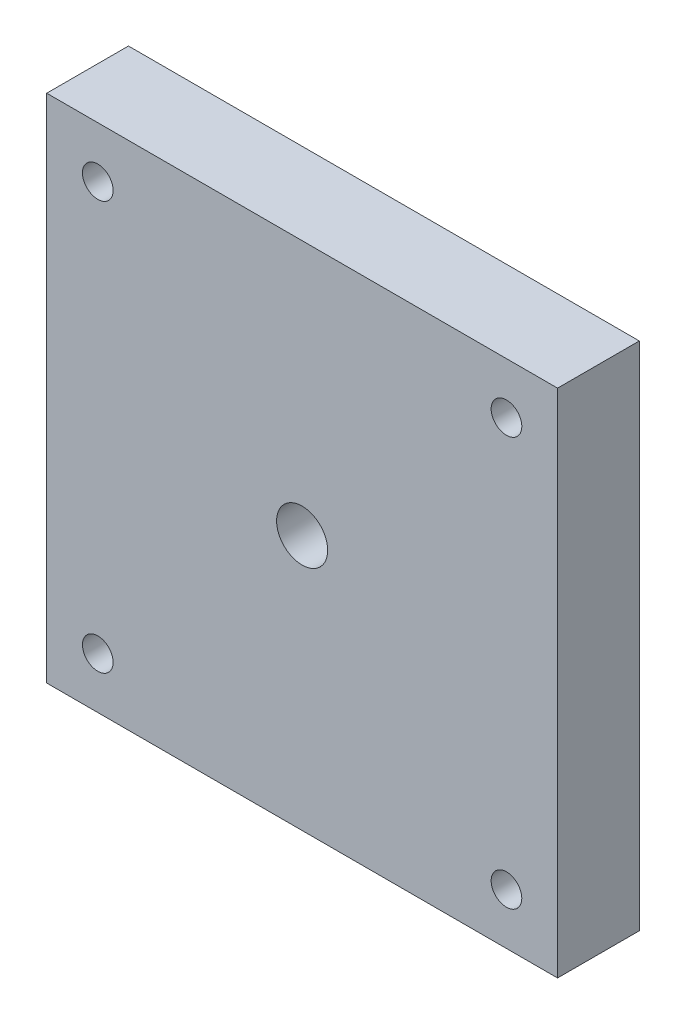
ISO-10303-21;
HEADER;
FILE_DESCRIPTION(('STEP AP214'),'2;1');
FILE_NAME('part.step','',(''),(''),'','','');
FILE_SCHEMA(('AUTOMOTIVE_DESIGN { 1 0 10303 214 1 1 1 1 }'));
ENDSEC;
DATA;
#1=APPLICATION_CONTEXT('core data for automotive mechanical design processes');
#2=APPLICATION_PROTOCOL_DEFINITION('international standard','automotive_design',2000,#1);
#3=PRODUCT_CONTEXT('',#1,'mechanical');
#4=PRODUCT('Part','Part','',(#3));
#5=PRODUCT_RELATED_PRODUCT_CATEGORY('part','',(#4));
#6=PRODUCT_DEFINITION_FORMATION('','',#4);
#7=PRODUCT_DEFINITION_CONTEXT('part definition',#1,'design');
#8=PRODUCT_DEFINITION('design','',#6,#7);
#9=PRODUCT_DEFINITION_SHAPE('','',#8);
#10=(LENGTH_UNIT() NAMED_UNIT(*) SI_UNIT(.MILLI.,.METRE.));
#11=(NAMED_UNIT(*) PLANE_ANGLE_UNIT() SI_UNIT($,.RADIAN.));
#12=(NAMED_UNIT(*) SI_UNIT($,.STERADIAN.) SOLID_ANGLE_UNIT());
#13=UNCERTAINTY_MEASURE_WITH_UNIT(LENGTH_MEASURE(1.E-05),#10,'distance_accuracy_value','');
#14=(GEOMETRIC_REPRESENTATION_CONTEXT(3) GLOBAL_UNCERTAINTY_ASSIGNED_CONTEXT((#13)) GLOBAL_UNIT_ASSIGNED_CONTEXT((#10,
#11,#12)) REPRESENTATION_CONTEXT('',''));
#15=CARTESIAN_POINT('',(0.,0.,0.));
#16=DIRECTION('',(0.,0.,1.));
#17=DIRECTION('',(1.,0.,0.));
#18=AXIS2_PLACEMENT_3D('',#15,#16,#17);
#19=CARTESIAN_POINT('',(0.,0.,8.));
#20=DIRECTION('',(0.,0.,1.));
#21=DIRECTION('',(1.,0.,0.));
#22=AXIS2_PLACEMENT_3D('',#19,#20,#21);
#23=PLANE('',#22);
#24=CARTESIAN_POINT('',(20.,-20.,8.));
#25=DIRECTION('',(0.,0.,1.));
#26=DIRECTION('',(1.,0.,0.));
#27=AXIS2_PLACEMENT_3D('',#24,#25,#26);
#28=CIRCLE('',#27,1.5);
#29=CARTESIAN_POINT('',(21.5,-20.,8.));
#30=VERTEX_POINT('',#29);
#31=EDGE_CURVE('E128',#30,#30,#28,.T.);
#32=ORIENTED_EDGE('',*,*,#31,.F.);
#33=EDGE_LOOP('',(#32));
#34=FACE_BOUND('',#33,.T.);
#35=CARTESIAN_POINT('',(-20.,20.,8.));
#36=DIRECTION('',(0.,0.,1.));
#37=DIRECTION('',(1.,0.,0.));
#38=AXIS2_PLACEMENT_3D('',#35,#36,#37);
#39=CIRCLE('',#38,1.5);
#40=CARTESIAN_POINT('',(-18.5,20.,8.));
#41=VERTEX_POINT('',#40);
#42=EDGE_CURVE('E116',#41,#41,#39,.T.);
#43=ORIENTED_EDGE('',*,*,#42,.F.);
#44=EDGE_LOOP('',(#43));
#45=FACE_BOUND('',#44,.T.);
#46=DIRECTION('',(0.,-1.,0.));
#47=VECTOR('',#46,1.);
#48=CARTESIAN_POINT('',(-25.,25.,8.));
#49=LINE('',#48,#47);
#50=CARTESIAN_POINT('',(-25.,25.,8.));
#51=VERTEX_POINT('',#50);
#52=CARTESIAN_POINT('',(-25.,-25.,8.));
#53=VERTEX_POINT('',#52);
#54=EDGE_CURVE('E86',#51,#53,#49,.T.);
#55=ORIENTED_EDGE('',*,*,#54,.T.);
#56=DIRECTION('',(1.,0.,0.));
#57=VECTOR('',#56,1.);
#58=CARTESIAN_POINT('',(-25.,-25.,8.));
#59=LINE('',#58,#57);
#60=CARTESIAN_POINT('',(25.,-25.,8.));
#61=VERTEX_POINT('',#60);
#62=EDGE_CURVE('E81',#53,#61,#59,.T.);
#63=ORIENTED_EDGE('',*,*,#62,.T.);
#64=DIRECTION('',(0.,1.,0.));
#65=VECTOR('',#64,1.);
#66=CARTESIAN_POINT('',(25.,25.,8.));
#67=LINE('',#66,#65);
#68=CARTESIAN_POINT('',(25.,25.,8.));
#69=VERTEX_POINT('',#68);
#70=EDGE_CURVE('E84',#61,#69,#67,.T.);
#71=ORIENTED_EDGE('',*,*,#70,.T.);
#72=DIRECTION('',(-1.,0.,0.));
#73=VECTOR('',#72,1.);
#74=CARTESIAN_POINT('',(-25.,25.,8.));
#75=LINE('',#74,#73);
#76=EDGE_CURVE('E51',#69,#51,#75,.T.);
#77=ORIENTED_EDGE('',*,*,#76,.T.);
#78=EDGE_LOOP('',(#55,#63,#71,#77));
#79=FACE_BOUND('',#78,.T.);
#80=CARTESIAN_POINT('',(0.,0.,8.));
#81=DIRECTION('',(0.,0.,1.));
#82=DIRECTION('',(1.,0.,0.));
#83=AXIS2_PLACEMENT_3D('',#80,#81,#82);
#84=CIRCLE('',#83,2.5);
#85=CARTESIAN_POINT('',(2.5,0.,8.));
#86=VERTEX_POINT('',#85);
#87=EDGE_CURVE('E101',#86,#86,#84,.T.);
#88=ORIENTED_EDGE('',*,*,#87,.F.);
#89=EDGE_LOOP('',(#88));
#90=FACE_BOUND('',#89,.T.);
#91=CARTESIAN_POINT('',(20.,20.,8.));
#92=DIRECTION('',(0.,0.,1.));
#93=DIRECTION('',(-1.,0.,0.));
#94=AXIS2_PLACEMENT_3D('',#91,#92,#93);
#95=CIRCLE('',#94,1.5);
#96=CARTESIAN_POINT('',(18.5,20.,8.));
#97=VERTEX_POINT('',#96);
#98=EDGE_CURVE('E122',#97,#97,#95,.T.);
#99=ORIENTED_EDGE('',*,*,#98,.F.);
#100=EDGE_LOOP('',(#99));
#101=FACE_BOUND('',#100,.T.);
#102=CARTESIAN_POINT('',(-20.,-20.,8.));
#103=DIRECTION('',(0.,0.,1.));
#104=DIRECTION('',(-1.,0.,0.));
#105=AXIS2_PLACEMENT_3D('',#102,#103,#104);
#106=CIRCLE('',#105,1.5);
#107=CARTESIAN_POINT('',(-21.5,-20.,8.));
#108=VERTEX_POINT('',#107);
#109=EDGE_CURVE('E134',#108,#108,#106,.T.);
#110=ORIENTED_EDGE('',*,*,#109,.F.);
#111=EDGE_LOOP('',(#110));
#112=FACE_BOUND('',#111,.T.);
#113=ADVANCED_FACE('F34',(#34,#45,#79,#90,#101,#112),#23,.T.);
#114=CARTESIAN_POINT('',(0.,0.,0.));
#115=DIRECTION('',(0.,0.,1.));
#116=DIRECTION('',(1.,0.,0.));
#117=AXIS2_PLACEMENT_3D('',#114,#115,#116);
#118=PLANE('',#117);
#119=CARTESIAN_POINT('',(20.,-20.,0.));
#120=DIRECTION('',(0.,0.,1.));
#121=DIRECTION('',(1.,0.,0.));
#122=AXIS2_PLACEMENT_3D('',#119,#120,#121);
#123=CIRCLE('',#122,1.5);
#124=CARTESIAN_POINT('',(21.5,-20.,0.));
#125=VERTEX_POINT('',#124);
#126=EDGE_CURVE('E131',#125,#125,#123,.T.);
#127=ORIENTED_EDGE('',*,*,#126,.T.);
#128=EDGE_LOOP('',(#127));
#129=FACE_BOUND('',#128,.T.);
#130=CARTESIAN_POINT('',(-20.,20.,0.));
#131=DIRECTION('',(0.,0.,1.));
#132=DIRECTION('',(1.,0.,0.));
#133=AXIS2_PLACEMENT_3D('',#130,#131,#132);
#134=CIRCLE('',#133,1.5);
#135=CARTESIAN_POINT('',(-18.5,20.,0.));
#136=VERTEX_POINT('',#135);
#137=EDGE_CURVE('E119',#136,#136,#134,.T.);
#138=ORIENTED_EDGE('',*,*,#137,.T.);
#139=EDGE_LOOP('',(#138));
#140=FACE_BOUND('',#139,.T.);
#141=DIRECTION('',(0.,-1.,0.));
#142=VECTOR('',#141,1.);
#143=CARTESIAN_POINT('',(-25.,25.,0.));
#144=LINE('',#143,#142);
#145=CARTESIAN_POINT('',(-25.,25.,0.));
#146=VERTEX_POINT('',#145);
#147=CARTESIAN_POINT('',(-25.,-25.,0.));
#148=VERTEX_POINT('',#147);
#149=EDGE_CURVE('E98',#146,#148,#144,.T.);
#150=ORIENTED_EDGE('',*,*,#149,.F.);
#151=DIRECTION('',(-1.,0.,0.));
#152=VECTOR('',#151,1.);
#153=CARTESIAN_POINT('',(-25.,25.,0.));
#154=LINE('',#153,#152);
#155=CARTESIAN_POINT('',(25.,25.,0.));
#156=VERTEX_POINT('',#155);
#157=EDGE_CURVE('E74',#156,#146,#154,.T.);
#158=ORIENTED_EDGE('',*,*,#157,.F.);
#159=DIRECTION('',(0.,1.,0.));
#160=VECTOR('',#159,1.);
#161=CARTESIAN_POINT('',(25.,25.,0.));
#162=LINE('',#161,#160);
#163=CARTESIAN_POINT('',(25.,-25.,0.));
#164=VERTEX_POINT('',#163);
#165=EDGE_CURVE('E68',#164,#156,#162,.T.);
#166=ORIENTED_EDGE('',*,*,#165,.F.);
#167=DIRECTION('',(1.,0.,0.));
#168=VECTOR('',#167,1.);
#169=CARTESIAN_POINT('',(-25.,-25.,0.));
#170=LINE('',#169,#168);
#171=EDGE_CURVE('E90',#148,#164,#170,.T.);
#172=ORIENTED_EDGE('',*,*,#171,.F.);
#173=EDGE_LOOP('',(#150,#158,#166,#172));
#174=FACE_BOUND('',#173,.T.);
#175=CARTESIAN_POINT('',(0.,0.,0.));
#176=DIRECTION('',(0.,0.,1.));
#177=DIRECTION('',(1.,0.,0.));
#178=AXIS2_PLACEMENT_3D('',#175,#176,#177);
#179=CIRCLE('',#178,2.5);
#180=CARTESIAN_POINT('',(2.5,0.,0.));
#181=VERTEX_POINT('',#180);
#182=EDGE_CURVE('E113',#181,#181,#179,.T.);
#183=ORIENTED_EDGE('',*,*,#182,.T.);
#184=EDGE_LOOP('',(#183));
#185=FACE_BOUND('',#184,.T.);
#186=CARTESIAN_POINT('',(20.,20.,0.));
#187=DIRECTION('',(0.,0.,1.));
#188=DIRECTION('',(-1.,0.,0.));
#189=AXIS2_PLACEMENT_3D('',#186,#187,#188);
#190=CIRCLE('',#189,1.5);
#191=CARTESIAN_POINT('',(18.5,20.,0.));
#192=VERTEX_POINT('',#191);
#193=EDGE_CURVE('E125',#192,#192,#190,.T.);
#194=ORIENTED_EDGE('',*,*,#193,.T.);
#195=EDGE_LOOP('',(#194));
#196=FACE_BOUND('',#195,.T.);
#197=CARTESIAN_POINT('',(-20.,-20.,0.));
#198=DIRECTION('',(0.,0.,1.));
#199=DIRECTION('',(-1.,0.,0.));
#200=AXIS2_PLACEMENT_3D('',#197,#198,#199);
#201=CIRCLE('',#200,1.5);
#202=CARTESIAN_POINT('',(-21.5,-20.,0.));
#203=VERTEX_POINT('',#202);
#204=EDGE_CURVE('E137',#203,#203,#201,.T.);
#205=ORIENTED_EDGE('',*,*,#204,.T.);
#206=EDGE_LOOP('',(#205));
#207=FACE_BOUND('',#206,.T.);
#208=ADVANCED_FACE('F109',(#129,#140,#174,#185,#196,#207),#118,.F.);
#209=CARTESIAN_POINT('',(-25.,25.,8.));
#210=DIRECTION('',(1.,0.,0.));
#211=DIRECTION('',(0.,1.,0.));
#212=AXIS2_PLACEMENT_3D('',#209,#210,#211);
#213=PLANE('',#212);
#214=ORIENTED_EDGE('',*,*,#149,.T.);
#215=DIRECTION('',(0.,0.,-1.));
#216=VECTOR('',#215,1.);
#217=CARTESIAN_POINT('',(-25.,-25.,8.));
#218=LINE('',#217,#216);
#219=EDGE_CURVE('E11',#53,#148,#218,.T.);
#220=ORIENTED_EDGE('',*,*,#219,.F.);
#221=ORIENTED_EDGE('',*,*,#54,.F.);
#222=DIRECTION('',(0.,0.,-1.));
#223=VECTOR('',#222,1.);
#224=CARTESIAN_POINT('',(-25.,25.,8.));
#225=LINE('',#224,#223);
#226=EDGE_CURVE('E94',#51,#146,#225,.T.);
#227=ORIENTED_EDGE('',*,*,#226,.T.);
#228=EDGE_LOOP('',(#214,#220,#221,#227));
#229=FACE_BOUND('',#228,.T.);
#230=ADVANCED_FACE('F36',(#229),#213,.F.);
#231=CARTESIAN_POINT('',(-25.,-25.,8.));
#232=DIRECTION('',(0.,1.,0.));
#233=DIRECTION('',(0.,0.,1.));
#234=AXIS2_PLACEMENT_3D('',#231,#232,#233);
#235=PLANE('',#234);
#236=ORIENTED_EDGE('',*,*,#171,.T.);
#237=DIRECTION('',(0.,0.,-1.));
#238=VECTOR('',#237,1.);
#239=CARTESIAN_POINT('',(25.,-25.,8.));
#240=LINE('',#239,#238);
#241=EDGE_CURVE('E43',#61,#164,#240,.T.);
#242=ORIENTED_EDGE('',*,*,#241,.F.);
#243=ORIENTED_EDGE('',*,*,#62,.F.);
#244=ORIENTED_EDGE('',*,*,#219,.T.);
#245=EDGE_LOOP('',(#236,#242,#243,#244));
#246=FACE_BOUND('',#245,.T.);
#247=ADVANCED_FACE('F89',(#246),#235,.F.);
#248=CARTESIAN_POINT('',(25.,25.,8.));
#249=DIRECTION('',(-1.,0.,0.));
#250=DIRECTION('',(0.,-1.,0.));
#251=AXIS2_PLACEMENT_3D('',#248,#249,#250);
#252=PLANE('',#251);
#253=ORIENTED_EDGE('',*,*,#165,.T.);
#254=DIRECTION('',(0.,0.,-1.));
#255=VECTOR('',#254,1.);
#256=CARTESIAN_POINT('',(25.,25.,8.));
#257=LINE('',#256,#255);
#258=EDGE_CURVE('E91',#69,#156,#257,.T.);
#259=ORIENTED_EDGE('',*,*,#258,.F.);
#260=ORIENTED_EDGE('',*,*,#70,.F.);
#261=ORIENTED_EDGE('',*,*,#241,.T.);
#262=EDGE_LOOP('',(#253,#259,#260,#261));
#263=FACE_BOUND('',#262,.T.);
#264=ADVANCED_FACE('F92',(#263),#252,.F.);
#265=CARTESIAN_POINT('',(-25.,25.,8.));
#266=DIRECTION('',(0.,-1.,0.));
#267=DIRECTION('',(0.,0.,-1.));
#268=AXIS2_PLACEMENT_3D('',#265,#266,#267);
#269=PLANE('',#268);
#270=ORIENTED_EDGE('',*,*,#157,.T.);
#271=ORIENTED_EDGE('',*,*,#226,.F.);
#272=ORIENTED_EDGE('',*,*,#76,.F.);
#273=ORIENTED_EDGE('',*,*,#258,.T.);
#274=EDGE_LOOP('',(#270,#271,#272,#273));
#275=FACE_BOUND('',#274,.T.);
#276=ADVANCED_FACE('F106',(#275),#269,.F.);
#277=CARTESIAN_POINT('',(0.,0.,8.));
#278=DIRECTION('',(0.,0.,-1.));
#279=DIRECTION('',(-1.,0.,0.));
#280=AXIS2_PLACEMENT_3D('',#277,#278,#279);
#281=CYLINDRICAL_SURFACE('',#280,2.5);
#282=ORIENTED_EDGE('',*,*,#87,.T.);
#283=EDGE_LOOP('',(#282));
#284=FACE_BOUND('',#283,.T.);
#285=ORIENTED_EDGE('',*,*,#182,.F.);
#286=EDGE_LOOP('',(#285));
#287=FACE_BOUND('',#286,.T.);
#288=ADVANCED_FACE('F157',(#284,#287),#281,.F.);
#289=CARTESIAN_POINT('',(-20.,20.,8.));
#290=DIRECTION('',(0.,0.,-1.));
#291=DIRECTION('',(-1.,0.,0.));
#292=AXIS2_PLACEMENT_3D('',#289,#290,#291);
#293=CYLINDRICAL_SURFACE('',#292,1.5);
#294=ORIENTED_EDGE('',*,*,#42,.T.);
#295=EDGE_LOOP('',(#294));
#296=FACE_BOUND('',#295,.T.);
#297=ORIENTED_EDGE('',*,*,#137,.F.);
#298=EDGE_LOOP('',(#297));
#299=FACE_BOUND('',#298,.T.);
#300=ADVANCED_FACE('F203',(#296,#299),#293,.F.);
#301=CARTESIAN_POINT('',(20.,20.,8.));
#302=DIRECTION('',(0.,0.,-1.));
#303=DIRECTION('',(-1.,0.,0.));
#304=AXIS2_PLACEMENT_3D('',#301,#302,#303);
#305=CYLINDRICAL_SURFACE('',#304,1.5);
#306=ORIENTED_EDGE('',*,*,#98,.T.);
#307=EDGE_LOOP('',(#306));
#308=FACE_BOUND('',#307,.T.);
#309=ORIENTED_EDGE('',*,*,#193,.F.);
#310=EDGE_LOOP('',(#309));
#311=FACE_BOUND('',#310,.T.);
#312=ADVANCED_FACE('F211',(#308,#311),#305,.F.);
#313=CARTESIAN_POINT('',(20.,-20.,8.));
#314=DIRECTION('',(0.,0.,-1.));
#315=DIRECTION('',(-1.,0.,0.));
#316=AXIS2_PLACEMENT_3D('',#313,#314,#315);
#317=CYLINDRICAL_SURFACE('',#316,1.5);
#318=ORIENTED_EDGE('',*,*,#31,.T.);
#319=EDGE_LOOP('',(#318));
#320=FACE_BOUND('',#319,.T.);
#321=ORIENTED_EDGE('',*,*,#126,.F.);
#322=EDGE_LOOP('',(#321));
#323=FACE_BOUND('',#322,.T.);
#324=ADVANCED_FACE('F219',(#320,#323),#317,.F.);
#325=CARTESIAN_POINT('',(-20.,-20.,8.));
#326=DIRECTION('',(0.,0.,-1.));
#327=DIRECTION('',(-1.,0.,0.));
#328=AXIS2_PLACEMENT_3D('',#325,#326,#327);
#329=CYLINDRICAL_SURFACE('',#328,1.5);
#330=ORIENTED_EDGE('',*,*,#109,.T.);
#331=EDGE_LOOP('',(#330));
#332=FACE_BOUND('',#331,.T.);
#333=ORIENTED_EDGE('',*,*,#204,.F.);
#334=EDGE_LOOP('',(#333));
#335=FACE_BOUND('',#334,.T.);
#336=ADVANCED_FACE('F143',(#332,#335),#329,.F.);
#337=CLOSED_SHELL('',(#113,#208,#230,#247,#264,#276,#288,#300,#312,#324,#336));
#338=MANIFOLD_SOLID_BREP('B2',#337);
#339=ADVANCED_BREP_SHAPE_REPRESENTATION('',(#18,#338),#14);
#340=SHAPE_DEFINITION_REPRESENTATION(#9,#339);
ENDSEC;
END-ISO-10303-21;
